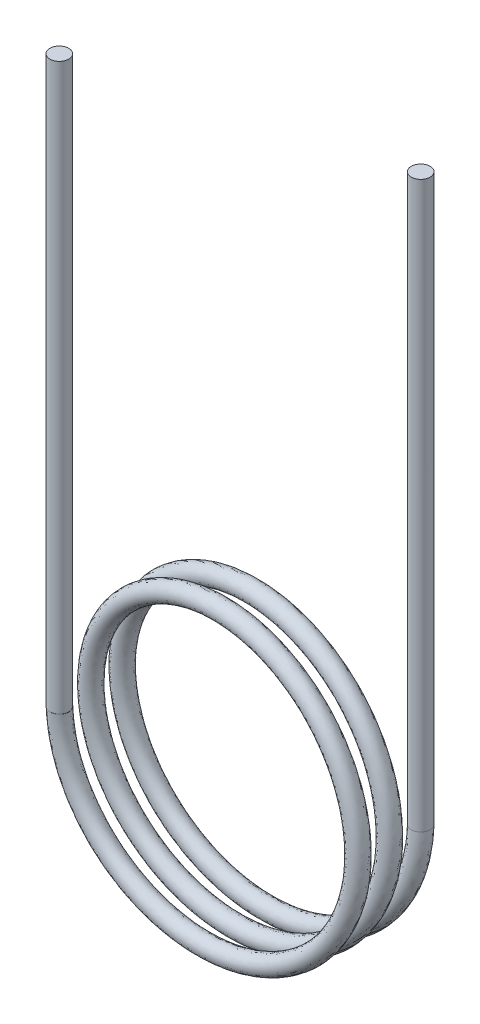
ISO-10303-21;
HEADER;
FILE_DESCRIPTION(('STEP AP214'),'2;1');
FILE_NAME('part.step','',(''),(''),'','','');
FILE_SCHEMA(('AUTOMOTIVE_DESIGN { 1 0 10303 214 1 1 1 1 }'));
ENDSEC;
DATA;
#1=APPLICATION_CONTEXT('core data for automotive mechanical design processes');
#2=APPLICATION_PROTOCOL_DEFINITION('international standard','automotive_design',2000,#1);
#3=PRODUCT_CONTEXT('',#1,'mechanical');
#4=PRODUCT('Part','Part','',(#3));
#5=PRODUCT_RELATED_PRODUCT_CATEGORY('part','',(#4));
#6=PRODUCT_DEFINITION_FORMATION('','',#4);
#7=PRODUCT_DEFINITION_CONTEXT('part definition',#1,'design');
#8=PRODUCT_DEFINITION('design','',#6,#7);
#9=PRODUCT_DEFINITION_SHAPE('','',#8);
#10=(LENGTH_UNIT() NAMED_UNIT(*) SI_UNIT(.MILLI.,.METRE.));
#11=(NAMED_UNIT(*) PLANE_ANGLE_UNIT() SI_UNIT($,.RADIAN.));
#12=(NAMED_UNIT(*) SI_UNIT($,.STERADIAN.) SOLID_ANGLE_UNIT());
#13=UNCERTAINTY_MEASURE_WITH_UNIT(LENGTH_MEASURE(1.E-05),#10,'distance_accuracy_value','');
#14=(GEOMETRIC_REPRESENTATION_CONTEXT(3) GLOBAL_UNCERTAINTY_ASSIGNED_CONTEXT((#13)) GLOBAL_UNIT_ASSIGNED_CONTEXT((#10,
#11,#12)) REPRESENTATION_CONTEXT('',''));
#15=CARTESIAN_POINT('',(0.,0.,0.));
#16=DIRECTION('',(0.,0.,1.));
#17=DIRECTION('',(1.,0.,0.));
#18=AXIS2_PLACEMENT_3D('',#15,#16,#17);
#19=CARTESIAN_POINT('',(-22.5,0.,11.));
#20=DIRECTION('',(0.,1.,0.));
#21=DIRECTION('',(-1.,0.,0.));
#22=AXIS2_PLACEMENT_3D('',#19,#20,#21);
#23=PLANE('',#22);
#24=CARTESIAN_POINT('',(-22.5,0.,12.5));
#25=DIRECTION('',(0.,1.,0.));
#26=DIRECTION('',(-1.,0.,0.));
#27=AXIS2_PLACEMENT_3D('',#24,#25,#26);
#28=CIRCLE('',#27,1.5);
#29=CARTESIAN_POINT('',(-22.5185919168882,0.,13.9998847757833));
#30=VERTEX_POINT('',#29);
#31=CARTESIAN_POINT('',(-22.5185919168882,0.,11.0001152242167));
#32=VERTEX_POINT('',#31);
#33=EDGE_CURVE('E11',#30,#32,#28,.T.);
#34=ORIENTED_EDGE('',*,*,#33,.T.);
#35=CARTESIAN_POINT('',(-22.5371838337765,0.,12.5));
#36=DIRECTION('',(0.,1.,0.));
#37=DIRECTION('',(-1.,0.,0.));
#38=AXIS2_PLACEMENT_3D('',#35,#36,#37);
#39=CIRCLE('',#38,1.5);
#40=EDGE_CURVE('E50',#30,#32,#39,.T.);
#41=ORIENTED_EDGE('',*,*,#40,.F.);
#42=EDGE_LOOP('',(#34,#41));
#43=FACE_BOUND('',#42,.T.);
#44=ADVANCED_FACE('F31',(#43),#23,.T.);
#45=CARTESIAN_POINT('',(22.5,0.,1.5));
#46=CARTESIAN_POINT('',(22.5,-6.02885682970026,1.70833333333333));
#47=CARTESIAN_POINT('',(19.4855715851499,-11.25,1.91666666666667));
#48=CARTESIAN_POINT('',(16.4711431702997,-16.4711431702997,2.125));
#49=CARTESIAN_POINT('',(11.25,-19.4855715851499,2.33333333333333));
#50=CARTESIAN_POINT('',(6.02885682970027,-22.5,2.54166666666667));
#51=CARTESIAN_POINT('',(0.,-22.5,2.75));
#52=CARTESIAN_POINT('',(-6.02885682970026,-22.5,2.95833333333333));
#53=CARTESIAN_POINT('',(-11.25,-19.4855715851499,3.16666666666667));
#54=CARTESIAN_POINT('',(-16.4711431702997,-16.4711431702997,3.375));
#55=CARTESIAN_POINT('',(-19.4855715851499,-11.25,3.58333333333333));
#56=CARTESIAN_POINT('',(-22.5,-6.02885682970027,3.79166666666667));
#57=CARTESIAN_POINT('',(-22.5,0.,4.));
#58=CARTESIAN_POINT('',(-22.5,6.02885682970025,4.20833333333333));
#59=CARTESIAN_POINT('',(-19.4855715851499,11.25,4.41666666666667));
#60=CARTESIAN_POINT('',(-16.4711431702997,16.4711431702997,4.625));
#61=CARTESIAN_POINT('',(-11.25,19.4855715851499,4.83333333333333));
#62=CARTESIAN_POINT('',(-6.02885682970028,22.5,5.04166666666667));
#63=CARTESIAN_POINT('',(0.,22.5,5.25));
#64=CARTESIAN_POINT('',(6.02885682970025,22.5,5.45833333333333));
#65=CARTESIAN_POINT('',(11.25,19.4855715851499,5.66666666666667));
#66=CARTESIAN_POINT('',(16.4711431702997,16.4711431702997,5.875));
#67=CARTESIAN_POINT('',(19.4855715851499,11.25,6.08333333333333));
#68=CARTESIAN_POINT('',(22.5,6.02885682970028,6.29166666666667));
#69=CARTESIAN_POINT('',(22.5,0.,6.5));
#70=CARTESIAN_POINT('',(22.5,-6.02885682970026,6.70833333333333));
#71=CARTESIAN_POINT('',(19.4855715851499,-11.25,6.91666666666667));
#72=CARTESIAN_POINT('',(16.4711431702997,-16.4711431702997,7.125));
#73=CARTESIAN_POINT('',(11.25,-19.4855715851499,7.33333333333333));
#74=CARTESIAN_POINT('',(6.02885682970027,-22.5,7.54166666666667));
#75=CARTESIAN_POINT('',(0.,-22.5,7.75));
#76=CARTESIAN_POINT('',(-6.02885682970026,-22.5,7.95833333333333));
#77=CARTESIAN_POINT('',(-11.25,-19.4855715851499,8.16666666666667));
#78=CARTESIAN_POINT('',(-16.4711431702997,-16.4711431702997,8.375));
#79=CARTESIAN_POINT('',(-19.4855715851499,-11.25,8.58333333333334));
#80=CARTESIAN_POINT('',(-22.5,-6.02885682970027,8.79166666666667));
#81=CARTESIAN_POINT('',(-22.5,0.,9.));
#82=CARTESIAN_POINT('',(-22.5,6.02885682970025,9.20833333333333));
#83=CARTESIAN_POINT('',(-19.4855715851499,11.25,9.41666666666667));
#84=CARTESIAN_POINT('',(-16.4711431702997,16.4711431702997,9.625));
#85=CARTESIAN_POINT('',(-11.25,19.4855715851499,9.83333333333333));
#86=CARTESIAN_POINT('',(-6.02885682970028,22.5,10.0416666666667));
#87=CARTESIAN_POINT('',(0.,22.5,10.25));
#88=CARTESIAN_POINT('',(6.02885682970025,22.5,10.4583333333333));
#89=CARTESIAN_POINT('',(11.25,19.4855715851499,10.6666666666667));
#90=CARTESIAN_POINT('',(16.4711431702997,16.4711431702997,10.875));
#91=CARTESIAN_POINT('',(19.4855715851499,11.25,11.0833333333333));
#92=CARTESIAN_POINT('',(22.5,6.02885682970028,11.2916666666667));
#93=CARTESIAN_POINT('',(22.5,0.,11.5));
#94=CARTESIAN_POINT('',(22.5,-6.02885682970026,11.7083333333333));
#95=CARTESIAN_POINT('',(19.4855715851499,-11.25,11.9166666666667));
#96=CARTESIAN_POINT('',(16.4711431702997,-16.4711431702997,12.125));
#97=CARTESIAN_POINT('',(11.25,-19.4855715851499,12.3333333333333));
#98=CARTESIAN_POINT('',(6.02885682970027,-22.5,12.5416666666667));
#99=CARTESIAN_POINT('',(0.,-22.5,12.75));
#100=CARTESIAN_POINT('',(-6.02885682970026,-22.5,12.9583333333333));
#101=CARTESIAN_POINT('',(-11.25,-19.4855715851499,13.1666666666667));
#102=CARTESIAN_POINT('',(-16.4711431702997,-16.4711431702997,13.375));
#103=CARTESIAN_POINT('',(-19.4855715851499,-11.25,13.5833333333333));
#104=CARTESIAN_POINT('',(-22.5,-6.02885682970027,13.7916666666667));
#105=CARTESIAN_POINT('',(-22.5,0.,14.));
#106=CARTESIAN_POINT('',(25.5,0.,1.5));
#107=CARTESIAN_POINT('',(25.5,-6.83270440699363,1.70833333333333));
#108=CARTESIAN_POINT('',(22.0836477965032,-12.75,1.91666666666667));
#109=CARTESIAN_POINT('',(18.6672955930064,-18.6672955930064,2.125));
#110=CARTESIAN_POINT('',(12.75,-22.0836477965032,2.33333333333333));
#111=CARTESIAN_POINT('',(6.83270440699364,-25.5,2.54166666666667));
#112=CARTESIAN_POINT('',(0.,-25.5,2.75));
#113=CARTESIAN_POINT('',(-6.83270440699363,-25.5,2.95833333333333));
#114=CARTESIAN_POINT('',(-12.75,-22.0836477965032,3.16666666666667));
#115=CARTESIAN_POINT('',(-18.6672955930064,-18.6672955930064,3.375));
#116=CARTESIAN_POINT('',(-22.0836477965032,-12.75,3.58333333333333));
#117=CARTESIAN_POINT('',(-25.5,-6.83270440699364,3.79166666666667));
#118=CARTESIAN_POINT('',(-25.5,0.,4.));
#119=CARTESIAN_POINT('',(-25.5,6.83270440699362,4.20833333333333));
#120=CARTESIAN_POINT('',(-22.0836477965032,12.75,4.41666666666667));
#121=CARTESIAN_POINT('',(-18.6672955930064,18.6672955930064,4.625));
#122=CARTESIAN_POINT('',(-12.75,22.0836477965032,4.83333333333333));
#123=CARTESIAN_POINT('',(-6.83270440699365,25.5,5.04166666666667));
#124=CARTESIAN_POINT('',(0.,25.5,5.25));
#125=CARTESIAN_POINT('',(6.83270440699362,25.5,5.45833333333333));
#126=CARTESIAN_POINT('',(12.75,22.0836477965032,5.66666666666667));
#127=CARTESIAN_POINT('',(18.6672955930064,18.6672955930064,5.875));
#128=CARTESIAN_POINT('',(22.0836477965032,12.75,6.08333333333333));
#129=CARTESIAN_POINT('',(25.5,6.83270440699365,6.29166666666667));
#130=CARTESIAN_POINT('',(25.5,0.,6.5));
#131=CARTESIAN_POINT('',(25.5,-6.83270440699363,6.70833333333333));
#132=CARTESIAN_POINT('',(22.0836477965032,-12.75,6.91666666666667));
#133=CARTESIAN_POINT('',(18.6672955930064,-18.6672955930064,7.125));
#134=CARTESIAN_POINT('',(12.75,-22.0836477965032,7.33333333333333));
#135=CARTESIAN_POINT('',(6.83270440699364,-25.5,7.54166666666667));
#136=CARTESIAN_POINT('',(0.,-25.5,7.75));
#137=CARTESIAN_POINT('',(-6.83270440699363,-25.5,7.95833333333334));
#138=CARTESIAN_POINT('',(-12.75,-22.0836477965032,8.16666666666667));
#139=CARTESIAN_POINT('',(-18.6672955930064,-18.6672955930064,8.375));
#140=CARTESIAN_POINT('',(-22.0836477965032,-12.75,8.58333333333334));
#141=CARTESIAN_POINT('',(-25.5,-6.83270440699364,8.79166666666667));
#142=CARTESIAN_POINT('',(-25.5,0.,9.));
#143=CARTESIAN_POINT('',(-25.5,6.83270440699362,9.20833333333333));
#144=CARTESIAN_POINT('',(-22.0836477965032,12.75,9.41666666666667));
#145=CARTESIAN_POINT('',(-18.6672955930064,18.6672955930064,9.625));
#146=CARTESIAN_POINT('',(-12.75,22.0836477965032,9.83333333333333));
#147=CARTESIAN_POINT('',(-6.83270440699365,25.5,10.0416666666667));
#148=CARTESIAN_POINT('',(0.,25.5,10.25));
#149=CARTESIAN_POINT('',(6.83270440699362,25.5,10.4583333333333));
#150=CARTESIAN_POINT('',(12.75,22.0836477965032,10.6666666666667));
#151=CARTESIAN_POINT('',(18.6672955930064,18.6672955930064,10.875));
#152=CARTESIAN_POINT('',(22.0836477965032,12.75,11.0833333333333));
#153=CARTESIAN_POINT('',(25.5,6.83270440699365,11.2916666666667));
#154=CARTESIAN_POINT('',(25.5,0.,11.5));
#155=CARTESIAN_POINT('',(25.5,-6.83270440699363,11.7083333333333));
#156=CARTESIAN_POINT('',(22.0836477965032,-12.75,11.9166666666667));
#157=CARTESIAN_POINT('',(18.6672955930064,-18.6672955930064,12.125));
#158=CARTESIAN_POINT('',(12.75,-22.0836477965032,12.3333333333333));
#159=CARTESIAN_POINT('',(6.83270440699364,-25.5,12.5416666666667));
#160=CARTESIAN_POINT('',(0.,-25.5,12.75));
#161=CARTESIAN_POINT('',(-6.83270440699363,-25.5,12.9583333333333));
#162=CARTESIAN_POINT('',(-12.75,-22.0836477965032,13.1666666666667));
#163=CARTESIAN_POINT('',(-18.6672955930064,-18.6672955930064,13.375));
#164=CARTESIAN_POINT('',(-22.0836477965032,-12.75,13.5833333333333));
#165=CARTESIAN_POINT('',(-25.5,-6.83270440699364,13.7916666666667));
#166=CARTESIAN_POINT('',(-25.5,0.,14.));
#167=CARTESIAN_POINT('',(25.5,0.,-1.5));
#168=CARTESIAN_POINT('',(25.5,-6.83270440699363,-1.29166666666667));
#169=CARTESIAN_POINT('',(22.0836477965032,-12.75,-1.08333333333333));
#170=CARTESIAN_POINT('',(18.6672955930064,-18.6672955930064,-0.875));
#171=CARTESIAN_POINT('',(12.75,-22.0836477965032,-0.666666666666667));
#172=CARTESIAN_POINT('',(6.83270440699364,-25.5,-0.458333333333333));
#173=CARTESIAN_POINT('',(0.,-25.5,-0.25));
#174=CARTESIAN_POINT('',(-6.83270440699363,-25.5,-0.0416666666666666));
#175=CARTESIAN_POINT('',(-12.75,-22.0836477965032,0.166666666666667));
#176=CARTESIAN_POINT('',(-18.6672955930064,-18.6672955930064,0.375));
#177=CARTESIAN_POINT('',(-22.0836477965032,-12.75,0.583333333333333));
#178=CARTESIAN_POINT('',(-25.5,-6.83270440699364,0.791666666666667));
#179=CARTESIAN_POINT('',(-25.5,0.,1.));
#180=CARTESIAN_POINT('',(-25.5,6.83270440699362,1.20833333333333));
#181=CARTESIAN_POINT('',(-22.0836477965032,12.75,1.41666666666667));
#182=CARTESIAN_POINT('',(-18.6672955930064,18.6672955930064,1.625));
#183=CARTESIAN_POINT('',(-12.75,22.0836477965032,1.83333333333333));
#184=CARTESIAN_POINT('',(-6.83270440699365,25.5,2.04166666666667));
#185=CARTESIAN_POINT('',(0.,25.5,2.25));
#186=CARTESIAN_POINT('',(6.83270440699362,25.5,2.45833333333333));
#187=CARTESIAN_POINT('',(12.75,22.0836477965032,2.66666666666667));
#188=CARTESIAN_POINT('',(18.6672955930064,18.6672955930064,2.875));
#189=CARTESIAN_POINT('',(22.0836477965032,12.75,3.08333333333333));
#190=CARTESIAN_POINT('',(25.5,6.83270440699365,3.29166666666667));
#191=CARTESIAN_POINT('',(25.5,0.,3.5));
#192=CARTESIAN_POINT('',(25.5,-6.83270440699363,3.70833333333333));
#193=CARTESIAN_POINT('',(22.0836477965032,-12.75,3.91666666666667));
#194=CARTESIAN_POINT('',(18.6672955930064,-18.6672955930064,4.125));
#195=CARTESIAN_POINT('',(12.75,-22.0836477965032,4.33333333333333));
#196=CARTESIAN_POINT('',(6.83270440699364,-25.5,4.54166666666667));
#197=CARTESIAN_POINT('',(0.,-25.5,4.75));
#198=CARTESIAN_POINT('',(-6.83270440699363,-25.5,4.95833333333333));
#199=CARTESIAN_POINT('',(-12.75,-22.0836477965032,5.16666666666667));
#200=CARTESIAN_POINT('',(-18.6672955930064,-18.6672955930064,5.375));
#201=CARTESIAN_POINT('',(-22.0836477965032,-12.75,5.58333333333333));
#202=CARTESIAN_POINT('',(-25.5,-6.83270440699364,5.79166666666667));
#203=CARTESIAN_POINT('',(-25.5,0.,6.));
#204=CARTESIAN_POINT('',(-25.5,6.83270440699362,6.20833333333333));
#205=CARTESIAN_POINT('',(-22.0836477965032,12.75,6.41666666666667));
#206=CARTESIAN_POINT('',(-18.6672955930064,18.6672955930064,6.625));
#207=CARTESIAN_POINT('',(-12.75,22.0836477965032,6.83333333333333));
#208=CARTESIAN_POINT('',(-6.83270440699365,25.5,7.04166666666667));
#209=CARTESIAN_POINT('',(0.,25.5,7.25));
#210=CARTESIAN_POINT('',(6.83270440699362,25.5,7.45833333333333));
#211=CARTESIAN_POINT('',(12.75,22.0836477965032,7.66666666666667));
#212=CARTESIAN_POINT('',(18.6672955930064,18.6672955930064,7.875));
#213=CARTESIAN_POINT('',(22.0836477965032,12.75,8.08333333333333));
#214=CARTESIAN_POINT('',(25.5,6.83270440699365,8.29166666666667));
#215=CARTESIAN_POINT('',(25.5,0.,8.5));
#216=CARTESIAN_POINT('',(25.5,-6.83270440699363,8.70833333333333));
#217=CARTESIAN_POINT('',(22.0836477965032,-12.75,8.91666666666667));
#218=CARTESIAN_POINT('',(18.6672955930064,-18.6672955930064,9.125));
#219=CARTESIAN_POINT('',(12.75,-22.0836477965032,9.33333333333333));
#220=CARTESIAN_POINT('',(6.83270440699364,-25.5,9.54166666666667));
#221=CARTESIAN_POINT('',(0.,-25.5,9.75));
#222=CARTESIAN_POINT('',(-6.83270440699363,-25.5,9.95833333333333));
#223=CARTESIAN_POINT('',(-12.75,-22.0836477965032,10.1666666666667));
#224=CARTESIAN_POINT('',(-18.6672955930064,-18.6672955930064,10.375));
#225=CARTESIAN_POINT('',(-22.0836477965032,-12.75,10.5833333333333));
#226=CARTESIAN_POINT('',(-25.5,-6.83270440699364,10.7916666666667));
#227=CARTESIAN_POINT('',(-25.5,0.,11.));
#228=CARTESIAN_POINT('',(22.5,0.,-1.5));
#229=CARTESIAN_POINT('',(22.5,-6.02885682970026,-1.29166666666667));
#230=CARTESIAN_POINT('',(19.4855715851499,-11.25,-1.08333333333333));
#231=CARTESIAN_POINT('',(16.4711431702997,-16.4711431702997,-0.875000000000001));
#232=CARTESIAN_POINT('',(11.25,-19.4855715851499,-0.666666666666667));
#233=CARTESIAN_POINT('',(6.02885682970027,-22.5,-0.458333333333334));
#234=CARTESIAN_POINT('',(0.,-22.5,-0.250000000000001));
#235=CARTESIAN_POINT('',(-6.02885682970026,-22.5,-0.0416666666666673));
#236=CARTESIAN_POINT('',(-11.25,-19.4855715851499,0.166666666666666));
#237=CARTESIAN_POINT('',(-16.4711431702997,-16.4711431702997,0.374999999999999));
#238=CARTESIAN_POINT('',(-19.4855715851499,-11.25,0.583333333333333));
#239=CARTESIAN_POINT('',(-22.5,-6.02885682970027,0.791666666666666));
#240=CARTESIAN_POINT('',(-22.5,0.,0.999999999999999));
#241=CARTESIAN_POINT('',(-22.5,6.02885682970025,1.20833333333333));
#242=CARTESIAN_POINT('',(-19.4855715851499,11.25,1.41666666666667));
#243=CARTESIAN_POINT('',(-16.4711431702997,16.4711431702997,1.625));
#244=CARTESIAN_POINT('',(-11.25,19.4855715851499,1.83333333333333));
#245=CARTESIAN_POINT('',(-6.02885682970028,22.5,2.04166666666667));
#246=CARTESIAN_POINT('',(0.,22.5,2.25));
#247=CARTESIAN_POINT('',(6.02885682970025,22.5,2.45833333333333));
#248=CARTESIAN_POINT('',(11.25,19.4855715851499,2.66666666666667));
#249=CARTESIAN_POINT('',(16.4711431702997,16.4711431702997,2.875));
#250=CARTESIAN_POINT('',(19.4855715851499,11.25,3.08333333333333));
#251=CARTESIAN_POINT('',(22.5,6.02885682970028,3.29166666666667));
#252=CARTESIAN_POINT('',(22.5,0.,3.5));
#253=CARTESIAN_POINT('',(22.5,-6.02885682970026,3.70833333333333));
#254=CARTESIAN_POINT('',(19.4855715851499,-11.25,3.91666666666667));
#255=CARTESIAN_POINT('',(16.4711431702997,-16.4711431702997,4.125));
#256=CARTESIAN_POINT('',(11.25,-19.4855715851499,4.33333333333333));
#257=CARTESIAN_POINT('',(6.02885682970027,-22.5,4.54166666666667));
#258=CARTESIAN_POINT('',(0.,-22.5,4.75));
#259=CARTESIAN_POINT('',(-6.02885682970026,-22.5,4.95833333333333));
#260=CARTESIAN_POINT('',(-11.25,-19.4855715851499,5.16666666666667));
#261=CARTESIAN_POINT('',(-16.4711431702997,-16.4711431702997,5.375));
#262=CARTESIAN_POINT('',(-19.4855715851499,-11.25,5.58333333333333));
#263=CARTESIAN_POINT('',(-22.5,-6.02885682970027,5.79166666666667));
#264=CARTESIAN_POINT('',(-22.5,0.,6.));
#265=CARTESIAN_POINT('',(-22.5,6.02885682970025,6.20833333333333));
#266=CARTESIAN_POINT('',(-19.4855715851499,11.25,6.41666666666667));
#267=CARTESIAN_POINT('',(-16.4711431702997,16.4711431702997,6.625));
#268=CARTESIAN_POINT('',(-11.25,19.4855715851499,6.83333333333333));
#269=CARTESIAN_POINT('',(-6.02885682970028,22.5,7.04166666666667));
#270=CARTESIAN_POINT('',(0.,22.5,7.25));
#271=CARTESIAN_POINT('',(6.02885682970025,22.5,7.45833333333333));
#272=CARTESIAN_POINT('',(11.25,19.4855715851499,7.66666666666667));
#273=CARTESIAN_POINT('',(16.4711431702997,16.4711431702997,7.875));
#274=CARTESIAN_POINT('',(19.4855715851499,11.25,8.08333333333333));
#275=CARTESIAN_POINT('',(22.5,6.02885682970028,8.29166666666667));
#276=CARTESIAN_POINT('',(22.5,0.,8.5));
#277=CARTESIAN_POINT('',(22.5,-6.02885682970026,8.70833333333333));
#278=CARTESIAN_POINT('',(19.4855715851499,-11.25,8.91666666666667));
#279=CARTESIAN_POINT('',(16.4711431702997,-16.4711431702997,9.125));
#280=CARTESIAN_POINT('',(11.25,-19.4855715851499,9.33333333333333));
#281=CARTESIAN_POINT('',(6.02885682970027,-22.5,9.54166666666667));
#282=CARTESIAN_POINT('',(0.,-22.5,9.75));
#283=CARTESIAN_POINT('',(-6.02885682970026,-22.5,9.95833333333333));
#284=CARTESIAN_POINT('',(-11.25,-19.4855715851499,10.1666666666667));
#285=CARTESIAN_POINT('',(-16.4711431702997,-16.4711431702997,10.375));
#286=CARTESIAN_POINT('',(-19.4855715851499,-11.25,10.5833333333333));
#287=CARTESIAN_POINT('',(-22.5,-6.02885682970027,10.7916666666667));
#288=CARTESIAN_POINT('',(-22.5,0.,11.));
#289=CARTESIAN_POINT('',(19.5,0.,-1.5));
#290=CARTESIAN_POINT('',(19.5,-5.22500925240689,-1.29166666666667));
#291=CARTESIAN_POINT('',(16.8874953737966,-9.75,-1.08333333333333));
#292=CARTESIAN_POINT('',(14.2749907475931,-14.2749907475931,-0.875000000000001));
#293=CARTESIAN_POINT('',(9.75,-16.8874953737966,-0.666666666666668));
#294=CARTESIAN_POINT('',(5.2250092524069,-19.5,-0.458333333333335));
#295=CARTESIAN_POINT('',(0.,-19.5,-0.250000000000001));
#296=CARTESIAN_POINT('',(-5.22500925240689,-19.5,-0.0416666666666677));
#297=CARTESIAN_POINT('',(-9.75,-16.8874953737966,0.166666666666666));
#298=CARTESIAN_POINT('',(-14.2749907475931,-14.2749907475931,0.374999999999999));
#299=CARTESIAN_POINT('',(-16.8874953737966,-9.75000000000001,0.583333333333332));
#300=CARTESIAN_POINT('',(-19.5,-5.2250092524069,0.791666666666666));
#301=CARTESIAN_POINT('',(-19.5,0.,0.999999999999999));
#302=CARTESIAN_POINT('',(-19.5,5.22500925240688,1.20833333333333));
#303=CARTESIAN_POINT('',(-16.8874953737966,9.74999999999999,1.41666666666667));
#304=CARTESIAN_POINT('',(-14.2749907475931,14.2749907475931,1.625));
#305=CARTESIAN_POINT('',(-9.75000000000001,16.8874953737965,1.83333333333333));
#306=CARTESIAN_POINT('',(-5.22500925240691,19.5,2.04166666666667));
#307=CARTESIAN_POINT('',(0.,19.5,2.25));
#308=CARTESIAN_POINT('',(5.22500925240688,19.5,2.45833333333333));
#309=CARTESIAN_POINT('',(9.74999999999999,16.8874953737966,2.66666666666667));
#310=CARTESIAN_POINT('',(14.2749907475931,14.2749907475931,2.875));
#311=CARTESIAN_POINT('',(16.8874953737965,9.75000000000001,3.08333333333333));
#312=CARTESIAN_POINT('',(19.5,5.22500925240691,3.29166666666667));
#313=CARTESIAN_POINT('',(19.5,0.,3.5));
#314=CARTESIAN_POINT('',(19.5,-5.22500925240689,3.70833333333333));
#315=CARTESIAN_POINT('',(16.8874953737966,-9.75,3.91666666666667));
#316=CARTESIAN_POINT('',(14.2749907475931,-14.2749907475931,4.125));
#317=CARTESIAN_POINT('',(9.75,-16.8874953737966,4.33333333333333));
#318=CARTESIAN_POINT('',(5.2250092524069,-19.5,4.54166666666667));
#319=CARTESIAN_POINT('',(0.,-19.5,4.75));
#320=CARTESIAN_POINT('',(-5.22500925240689,-19.5,4.95833333333333));
#321=CARTESIAN_POINT('',(-9.75,-16.8874953737966,5.16666666666667));
#322=CARTESIAN_POINT('',(-14.2749907475931,-14.2749907475931,5.375));
#323=CARTESIAN_POINT('',(-16.8874953737966,-9.75000000000001,5.58333333333333));
#324=CARTESIAN_POINT('',(-19.5,-5.2250092524069,5.79166666666667));
#325=CARTESIAN_POINT('',(-19.5,0.,6.));
#326=CARTESIAN_POINT('',(-19.5,5.22500925240688,6.20833333333333));
#327=CARTESIAN_POINT('',(-16.8874953737966,9.74999999999999,6.41666666666667));
#328=CARTESIAN_POINT('',(-14.2749907475931,14.2749907475931,6.625));
#329=CARTESIAN_POINT('',(-9.75000000000001,16.8874953737965,6.83333333333333));
#330=CARTESIAN_POINT('',(-5.22500925240691,19.5,7.04166666666667));
#331=CARTESIAN_POINT('',(0.,19.5,7.25));
#332=CARTESIAN_POINT('',(5.22500925240688,19.5,7.45833333333333));
#333=CARTESIAN_POINT('',(9.74999999999999,16.8874953737966,7.66666666666667));
#334=CARTESIAN_POINT('',(14.2749907475931,14.2749907475931,7.875));
#335=CARTESIAN_POINT('',(16.8874953737965,9.75000000000001,8.08333333333333));
#336=CARTESIAN_POINT('',(19.5,5.22500925240691,8.29166666666667));
#337=CARTESIAN_POINT('',(19.5,0.,8.5));
#338=CARTESIAN_POINT('',(19.5,-5.22500925240689,8.70833333333333));
#339=CARTESIAN_POINT('',(16.8874953737966,-9.75,8.91666666666667));
#340=CARTESIAN_POINT('',(14.2749907475931,-14.2749907475931,9.125));
#341=CARTESIAN_POINT('',(9.75,-16.8874953737966,9.33333333333333));
#342=CARTESIAN_POINT('',(5.2250092524069,-19.5,9.54166666666667));
#343=CARTESIAN_POINT('',(0.,-19.5,9.75));
#344=CARTESIAN_POINT('',(-5.22500925240689,-19.5,9.95833333333333));
#345=CARTESIAN_POINT('',(-9.75,-16.8874953737966,10.1666666666667));
#346=CARTESIAN_POINT('',(-14.2749907475931,-14.2749907475931,10.375));
#347=CARTESIAN_POINT('',(-16.8874953737966,-9.75000000000001,10.5833333333333));
#348=CARTESIAN_POINT('',(-19.5,-5.2250092524069,10.7916666666667));
#349=CARTESIAN_POINT('',(-19.5,0.,11.));
#350=CARTESIAN_POINT('',(19.5,0.,1.5));
#351=CARTESIAN_POINT('',(19.5,-5.22500925240689,1.70833333333333));
#352=CARTESIAN_POINT('',(16.8874953737966,-9.75,1.91666666666667));
#353=CARTESIAN_POINT('',(14.2749907475931,-14.2749907475931,2.125));
#354=CARTESIAN_POINT('',(9.75,-16.8874953737966,2.33333333333333));
#355=CARTESIAN_POINT('',(5.2250092524069,-19.5,2.54166666666667));
#356=CARTESIAN_POINT('',(0.,-19.5,2.75));
#357=CARTESIAN_POINT('',(-5.22500925240689,-19.5,2.95833333333333));
#358=CARTESIAN_POINT('',(-9.75,-16.8874953737966,3.16666666666667));
#359=CARTESIAN_POINT('',(-14.2749907475931,-14.2749907475931,3.375));
#360=CARTESIAN_POINT('',(-16.8874953737966,-9.75000000000001,3.58333333333333));
#361=CARTESIAN_POINT('',(-19.5,-5.2250092524069,3.79166666666667));
#362=CARTESIAN_POINT('',(-19.5,0.,4.));
#363=CARTESIAN_POINT('',(-19.5,5.22500925240688,4.20833333333333));
#364=CARTESIAN_POINT('',(-16.8874953737966,9.74999999999999,4.41666666666667));
#365=CARTESIAN_POINT('',(-14.2749907475931,14.2749907475931,4.625));
#366=CARTESIAN_POINT('',(-9.75000000000001,16.8874953737965,4.83333333333333));
#367=CARTESIAN_POINT('',(-5.22500925240691,19.5,5.04166666666667));
#368=CARTESIAN_POINT('',(0.,19.5,5.25));
#369=CARTESIAN_POINT('',(5.22500925240688,19.5,5.45833333333333));
#370=CARTESIAN_POINT('',(9.74999999999999,16.8874953737966,5.66666666666667));
#371=CARTESIAN_POINT('',(14.2749907475931,14.2749907475931,5.875));
#372=CARTESIAN_POINT('',(16.8874953737965,9.75000000000001,6.08333333333333));
#373=CARTESIAN_POINT('',(19.5,5.22500925240691,6.29166666666667));
#374=CARTESIAN_POINT('',(19.5,0.,6.5));
#375=CARTESIAN_POINT('',(19.5,-5.22500925240689,6.70833333333333));
#376=CARTESIAN_POINT('',(16.8874953737966,-9.75,6.91666666666667));
#377=CARTESIAN_POINT('',(14.2749907475931,-14.2749907475931,7.125));
#378=CARTESIAN_POINT('',(9.75,-16.8874953737966,7.33333333333333));
#379=CARTESIAN_POINT('',(5.2250092524069,-19.5,7.54166666666667));
#380=CARTESIAN_POINT('',(0.,-19.5,7.75));
#381=CARTESIAN_POINT('',(-5.22500925240689,-19.5,7.95833333333334));
#382=CARTESIAN_POINT('',(-9.75,-16.8874953737966,8.16666666666667));
#383=CARTESIAN_POINT('',(-14.2749907475931,-14.2749907475931,8.375));
#384=CARTESIAN_POINT('',(-16.8874953737966,-9.75000000000001,8.58333333333334));
#385=CARTESIAN_POINT('',(-19.5,-5.2250092524069,8.79166666666667));
#386=CARTESIAN_POINT('',(-19.5,0.,9.));
#387=CARTESIAN_POINT('',(-19.5,5.22500925240688,9.20833333333333));
#388=CARTESIAN_POINT('',(-16.8874953737966,9.74999999999999,9.41666666666667));
#389=CARTESIAN_POINT('',(-14.2749907475931,14.2749907475931,9.625));
#390=CARTESIAN_POINT('',(-9.75000000000001,16.8874953737965,9.83333333333333));
#391=CARTESIAN_POINT('',(-5.22500925240691,19.5,10.0416666666667));
#392=CARTESIAN_POINT('',(0.,19.5,10.25));
#393=CARTESIAN_POINT('',(5.22500925240688,19.5,10.4583333333333));
#394=CARTESIAN_POINT('',(9.74999999999999,16.8874953737966,10.6666666666667));
#395=CARTESIAN_POINT('',(14.2749907475931,14.2749907475931,10.875));
#396=CARTESIAN_POINT('',(16.8874953737965,9.75000000000001,11.0833333333333));
#397=CARTESIAN_POINT('',(19.5,5.22500925240691,11.2916666666667));
#398=CARTESIAN_POINT('',(19.5,0.,11.5));
#399=CARTESIAN_POINT('',(19.5,-5.22500925240689,11.7083333333333));
#400=CARTESIAN_POINT('',(16.8874953737966,-9.75,11.9166666666667));
#401=CARTESIAN_POINT('',(14.2749907475931,-14.2749907475931,12.125));
#402=CARTESIAN_POINT('',(9.75,-16.8874953737966,12.3333333333333));
#403=CARTESIAN_POINT('',(5.2250092524069,-19.5,12.5416666666667));
#404=CARTESIAN_POINT('',(0.,-19.5,12.75));
#405=CARTESIAN_POINT('',(-5.22500925240689,-19.5,12.9583333333333));
#406=CARTESIAN_POINT('',(-9.75,-16.8874953737966,13.1666666666667));
#407=CARTESIAN_POINT('',(-14.2749907475931,-14.2749907475931,13.375));
#408=CARTESIAN_POINT('',(-16.8874953737966,-9.75000000000001,13.5833333333333));
#409=CARTESIAN_POINT('',(-19.5,-5.2250092524069,13.7916666666667));
#410=CARTESIAN_POINT('',(-19.5,0.,14.));
#411=CARTESIAN_POINT('',(22.5,0.,1.5));
#412=CARTESIAN_POINT('',(22.5,-6.02885682970026,1.70833333333333));
#413=CARTESIAN_POINT('',(19.4855715851499,-11.25,1.91666666666667));
#414=CARTESIAN_POINT('',(16.4711431702997,-16.4711431702997,2.125));
#415=CARTESIAN_POINT('',(11.25,-19.4855715851499,2.33333333333333));
#416=CARTESIAN_POINT('',(6.02885682970027,-22.5,2.54166666666667));
#417=CARTESIAN_POINT('',(0.,-22.5,2.75));
#418=CARTESIAN_POINT('',(-6.02885682970026,-22.5,2.95833333333333));
#419=CARTESIAN_POINT('',(-11.25,-19.4855715851499,3.16666666666667));
#420=CARTESIAN_POINT('',(-16.4711431702997,-16.4711431702997,3.375));
#421=CARTESIAN_POINT('',(-19.4855715851499,-11.25,3.58333333333333));
#422=CARTESIAN_POINT('',(-22.5,-6.02885682970027,3.79166666666667));
#423=CARTESIAN_POINT('',(-22.5,0.,4.));
#424=CARTESIAN_POINT('',(-22.5,6.02885682970025,4.20833333333333));
#425=CARTESIAN_POINT('',(-19.4855715851499,11.25,4.41666666666667));
#426=CARTESIAN_POINT('',(-16.4711431702997,16.4711431702997,4.625));
#427=CARTESIAN_POINT('',(-11.25,19.4855715851499,4.83333333333333));
#428=CARTESIAN_POINT('',(-6.02885682970028,22.5,5.04166666666667));
#429=CARTESIAN_POINT('',(0.,22.5,5.25));
#430=CARTESIAN_POINT('',(6.02885682970025,22.5,5.45833333333333));
#431=CARTESIAN_POINT('',(11.25,19.4855715851499,5.66666666666667));
#432=CARTESIAN_POINT('',(16.4711431702997,16.4711431702997,5.875));
#433=CARTESIAN_POINT('',(19.4855715851499,11.25,6.08333333333333));
#434=CARTESIAN_POINT('',(22.5,6.02885682970028,6.29166666666667));
#435=CARTESIAN_POINT('',(22.5,0.,6.5));
#436=CARTESIAN_POINT('',(22.5,-6.02885682970026,6.70833333333333));
#437=CARTESIAN_POINT('',(19.4855715851499,-11.25,6.91666666666667));
#438=CARTESIAN_POINT('',(16.4711431702997,-16.4711431702997,7.125));
#439=CARTESIAN_POINT('',(11.25,-19.4855715851499,7.33333333333333));
#440=CARTESIAN_POINT('',(6.02885682970027,-22.5,7.54166666666667));
#441=CARTESIAN_POINT('',(0.,-22.5,7.75));
#442=CARTESIAN_POINT('',(-6.02885682970026,-22.5,7.95833333333333));
#443=CARTESIAN_POINT('',(-11.25,-19.4855715851499,8.16666666666667));
#444=CARTESIAN_POINT('',(-16.4711431702997,-16.4711431702997,8.375));
#445=CARTESIAN_POINT('',(-19.4855715851499,-11.25,8.58333333333334));
#446=CARTESIAN_POINT('',(-22.5,-6.02885682970027,8.79166666666667));
#447=CARTESIAN_POINT('',(-22.5,0.,9.));
#448=CARTESIAN_POINT('',(-22.5,6.02885682970025,9.20833333333333));
#449=CARTESIAN_POINT('',(-19.4855715851499,11.25,9.41666666666667));
#450=CARTESIAN_POINT('',(-16.4711431702997,16.4711431702997,9.625));
#451=CARTESIAN_POINT('',(-11.25,19.4855715851499,9.83333333333333));
#452=CARTESIAN_POINT('',(-6.02885682970028,22.5,10.0416666666667));
#453=CARTESIAN_POINT('',(0.,22.5,10.25));
#454=CARTESIAN_POINT('',(6.02885682970025,22.5,10.4583333333333));
#455=CARTESIAN_POINT('',(11.25,19.4855715851499,10.6666666666667));
#456=CARTESIAN_POINT('',(16.4711431702997,16.4711431702997,10.875));
#457=CARTESIAN_POINT('',(19.4855715851499,11.25,11.0833333333333));
#458=CARTESIAN_POINT('',(22.5,6.02885682970028,11.2916666666667));
#459=CARTESIAN_POINT('',(22.5,0.,11.5));
#460=CARTESIAN_POINT('',(22.5,-6.02885682970026,11.7083333333333));
#461=CARTESIAN_POINT('',(19.4855715851499,-11.25,11.9166666666667));
#462=CARTESIAN_POINT('',(16.4711431702997,-16.4711431702997,12.125));
#463=CARTESIAN_POINT('',(11.25,-19.4855715851499,12.3333333333333));
#464=CARTESIAN_POINT('',(6.02885682970027,-22.5,12.5416666666667));
#465=CARTESIAN_POINT('',(0.,-22.5,12.75));
#466=CARTESIAN_POINT('',(-6.02885682970026,-22.5,12.9583333333333));
#467=CARTESIAN_POINT('',(-11.25,-19.4855715851499,13.1666666666667));
#468=CARTESIAN_POINT('',(-16.4711431702997,-16.4711431702997,13.375));
#469=CARTESIAN_POINT('',(-19.4855715851499,-11.25,13.5833333333333));
#470=CARTESIAN_POINT('',(-22.5,-6.02885682970027,13.7916666666667));
#471=CARTESIAN_POINT('',(-22.5,0.,14.));
#472=(BOUNDED_SURFACE() B_SPLINE_SURFACE(3,2,((#45,#46,#47,#48,#49,#50,#51,#52,#53,#54,#55,#56,
#57,#58,#59,#60,#61,#62,#63,#64,#65,#66,#67,#68,#69,#70,#71,#72,#73,#74,#75,#76,#77,#78,#79,#80,
#81,#82,#83,#84,#85,#86,#87,#88,#89,#90,#91,#92,#93,#94,#95,#96,#97,#98,#99,#100,#101,#102,#103,
#104,#105),(#106,#107,#108,#109,#110,#111,#112,#113,#114,#115,#116,#117,#118,#119,#120,#121,
#122,#123,#124,#125,#126,#127,#128,#129,#130,#131,#132,#133,#134,#135,#136,#137,#138,#139,#140,
#141,#142,#143,#144,#145,#146,#147,#148,#149,#150,#151,#152,#153,#154,#155,#156,#157,#158,#159,
#160,#161,#162,#163,#164,#165,#166),(#167,#168,#169,#170,#171,#172,#173,#174,#175,#176,#177,
#178,#179,#180,#181,#182,#183,#184,#185,#186,#187,#188,#189,#190,#191,#192,#193,#194,#195,#196,
#197,#198,#199,#200,#201,#202,#203,#204,#205,#206,#207,#208,#209,#210,#211,#212,#213,#214,#215,
#216,#217,#218,#219,#220,#221,#222,#223,#224,#225,#226,#227),(#228,#229,#230,#231,#232,#233,
#234,#235,#236,#237,#238,#239,#240,#241,#242,#243,#244,#245,#246,#247,#248,#249,#250,#251,#252,
#253,#254,#255,#256,#257,#258,#259,#260,#261,#262,#263,#264,#265,#266,#267,#268,#269,#270,#271,
#272,#273,#274,#275,#276,#277,#278,#279,#280,#281,#282,#283,#284,#285,#286,#287,#288),(#289,
#290,#291,#292,#293,#294,#295,#296,#297,#298,#299,#300,#301,#302,#303,#304,#305,#306,#307,#308,
#309,#310,#311,#312,#313,#314,#315,#316,#317,#318,#319,#320,#321,#322,#323,#324,#325,#326,#327,
#328,#329,#330,#331,#332,#333,#334,#335,#336,#337,#338,#339,#340,#341,#342,#343,#344,#345,#346,
#347,#348,#349),(#350,#351,#352,#353,#354,#355,#356,#357,#358,#359,#360,#361,#362,#363,#364,
#365,#366,#367,#368,#369,#370,#371,#372,#373,#374,#375,#376,#377,#378,#379,#380,#381,#382,#383,
#384,#385,#386,#387,#388,#389,#390,#391,#392,#393,#394,#395,#396,#397,#398,#399,#400,#401,#402,
#403,#404,#405,#406,#407,#408,#409,#410),(#411,#412,#413,#414,#415,#416,#417,#418,#419,#420,
#421,#422,#423,#424,#425,#426,#427,#428,#429,#430,#431,#432,#433,#434,#435,#436,#437,#438,#439,
#440,#441,#442,#443,#444,#445,#446,#447,#448,#449,#450,#451,#452,#453,#454,#455,#456,#457,#458,
#459,#460,#461,#462,#463,#464,#465,#466,#467,#468,#469,#470,#471)),.UNSPECIFIED.,.T.,.F.,
.F.) B_SPLINE_SURFACE_WITH_KNOTS((4,3,4),(3,2,2,2,2,2,2,2,2,2,2,2,2,2,2,2,2,2,2,2,2,2,2,2,2,2,2,
2,2,2,3),(0.,0.5,1.),(0.,0.0277777777777778,0.0555555555555556,0.0833333333333333,
0.111111111111111,0.138888888888889,0.166666666666667,0.194444444444444,0.222222222222222,0.25,
0.277777777777778,0.305555555555556,0.333333333333333,0.361111111111111,0.388888888888889,
0.416666666666667,0.444444444444444,0.472222222222222,0.5,0.527777777777778,0.555555555555556,
0.583333333333333,0.611111111111111,0.638888888888889,0.666666666666667,0.694444444444444,
0.722222222222222,0.75,0.777777777777778,0.805555555555555,0.833333333333333),
.UNSPECIFIED.) GEOMETRIC_REPRESENTATION_ITEM() RATIONAL_B_SPLINE_SURFACE(((1.,0.965925826289068,
1.,0.965925826289068,1.,0.965925826289068,1.,0.965925826289068,1.,0.965925826289068,1.,
0.965925826289068,1.,0.965925826289068,1.,0.965925826289068,1.,0.965925826289068,1.,
0.965925826289068,1.,0.965925826289068,1.,0.965925826289068,1.,0.965925826289068,1.,
0.965925826289068,1.,0.965925826289068,1.,0.965925826289068,1.,0.965925826289068,1.,
0.965925826289068,1.,0.965925826289068,1.,0.965925826289068,1.,0.965925826289068,1.,
0.965925826289068,1.,0.965925826289068,1.,0.965925826289068,1.,0.965925826289068,1.,
0.965925826289068,1.,0.965925826289068,1.,0.965925826289068,1.,0.965925826289068,1.,
0.965925826289068,1.),(0.333333333333333,0.321975275429689,0.333333333333333,0.321975275429689,
0.333333333333333,0.321975275429689,0.333333333333333,0.321975275429689,0.333333333333333,
0.321975275429689,0.333333333333333,0.321975275429689,0.333333333333333,0.321975275429689,
0.333333333333333,0.321975275429689,0.333333333333333,0.321975275429689,0.333333333333333,
0.321975275429689,0.333333333333333,0.321975275429689,0.333333333333333,0.321975275429689,
0.333333333333333,0.321975275429689,0.333333333333333,0.321975275429689,0.333333333333333,
0.321975275429689,0.333333333333333,0.321975275429689,0.333333333333333,0.321975275429689,
0.333333333333333,0.321975275429689,0.333333333333333,0.321975275429689,0.333333333333333,
0.321975275429689,0.333333333333333,0.321975275429689,0.333333333333333,0.321975275429689,
0.333333333333333,0.321975275429689,0.333333333333333,0.321975275429689,0.333333333333333,
0.321975275429689,0.333333333333333,0.321975275429689,0.333333333333333,0.321975275429689,
0.333333333333333,0.321975275429689,0.333333333333333,0.321975275429689,0.333333333333333,
0.321975275429689,0.333333333333333),(0.333333333333333,0.321975275429689,0.333333333333333,
0.321975275429689,0.333333333333333,0.321975275429689,0.333333333333333,0.321975275429689,
0.333333333333333,0.321975275429689,0.333333333333333,0.321975275429689,0.333333333333333,
0.321975275429689,0.333333333333333,0.321975275429689,0.333333333333333,0.321975275429689,
0.333333333333333,0.321975275429689,0.333333333333333,0.321975275429689,0.333333333333333,
0.321975275429689,0.333333333333333,0.321975275429689,0.333333333333333,0.321975275429689,
0.333333333333333,0.321975275429689,0.333333333333333,0.321975275429689,0.333333333333333,
0.321975275429689,0.333333333333333,0.321975275429689,0.333333333333333,0.321975275429689,
0.333333333333333,0.321975275429689,0.333333333333333,0.321975275429689,0.333333333333333,
0.321975275429689,0.333333333333333,0.321975275429689,0.333333333333333,0.321975275429689,
0.333333333333333,0.321975275429689,0.333333333333333,0.321975275429689,0.333333333333333,
0.321975275429689,0.333333333333333,0.321975275429689,0.333333333333333,0.321975275429689,
0.333333333333333,0.321975275429689,0.333333333333333),(1.,0.965925826289068,1.,
0.965925826289068,1.,0.965925826289068,1.,0.965925826289068,1.,0.965925826289068,1.,
0.965925826289068,1.,0.965925826289068,1.,0.965925826289068,1.,0.965925826289068,1.,
0.965925826289068,1.,0.965925826289068,1.,0.965925826289068,1.,0.965925826289068,1.,
0.965925826289068,1.,0.965925826289068,1.,0.965925826289068,1.,0.965925826289068,1.,
0.965925826289068,1.,0.965925826289068,1.,0.965925826289068,1.,0.965925826289068,1.,
0.965925826289068,1.,0.965925826289068,1.,0.965925826289068,1.,0.965925826289068,1.,
0.965925826289068,1.,0.965925826289068,1.,0.965925826289068,1.,0.965925826289068,1.,
0.965925826289068,1.),(0.333333333333333,0.321975275429689,0.333333333333333,0.321975275429689,
0.333333333333333,0.321975275429689,0.333333333333333,0.321975275429689,0.333333333333333,
0.321975275429689,0.333333333333333,0.321975275429689,0.333333333333333,0.321975275429689,
0.333333333333333,0.321975275429689,0.333333333333333,0.321975275429689,0.333333333333333,
0.321975275429689,0.333333333333333,0.321975275429689,0.333333333333333,0.321975275429689,
0.333333333333333,0.321975275429689,0.333333333333333,0.321975275429689,0.333333333333333,
0.321975275429689,0.333333333333333,0.321975275429689,0.333333333333333,0.321975275429689,
0.333333333333333,0.321975275429689,0.333333333333333,0.321975275429689,0.333333333333333,
0.321975275429689,0.333333333333333,0.321975275429689,0.333333333333333,0.321975275429689,
0.333333333333333,0.321975275429689,0.333333333333333,0.321975275429689,0.333333333333333,
0.321975275429689,0.333333333333333,0.321975275429689,0.333333333333333,0.321975275429689,
0.333333333333333,0.321975275429689,0.333333333333333,0.321975275429689,0.333333333333333,
0.321975275429689,0.333333333333333),(0.333333333333333,0.321975275429689,0.333333333333333,
0.321975275429689,0.333333333333333,0.321975275429689,0.333333333333333,0.321975275429689,
0.333333333333333,0.321975275429689,0.333333333333333,0.321975275429689,0.333333333333333,
0.321975275429689,0.333333333333333,0.321975275429689,0.333333333333333,0.321975275429689,
0.333333333333333,0.321975275429689,0.333333333333333,0.321975275429689,0.333333333333333,
0.321975275429689,0.333333333333333,0.321975275429689,0.333333333333333,0.321975275429689,
0.333333333333333,0.321975275429689,0.333333333333333,0.321975275429689,0.333333333333333,
0.321975275429689,0.333333333333333,0.321975275429689,0.333333333333333,0.321975275429689,
0.333333333333333,0.321975275429689,0.333333333333333,0.321975275429689,0.333333333333333,
0.321975275429689,0.333333333333333,0.321975275429689,0.333333333333333,0.321975275429689,
0.333333333333333,0.321975275429689,0.333333333333333,0.321975275429689,0.333333333333333,
0.321975275429689,0.333333333333333,0.321975275429689,0.333333333333333,0.321975275429689,
0.333333333333333,0.321975275429689,0.333333333333333),(1.,0.965925826289068,1.,
0.965925826289068,1.,0.965925826289068,1.,0.965925826289068,1.,0.965925826289068,1.,
0.965925826289068,1.,0.965925826289068,1.,0.965925826289068,1.,0.965925826289068,1.,
0.965925826289068,1.,0.965925826289068,1.,0.965925826289068,1.,0.965925826289068,1.,
0.965925826289068,1.,0.965925826289068,1.,0.965925826289068,1.,0.965925826289068,1.,
0.965925826289068,1.,0.965925826289068,1.,0.965925826289068,1.,0.965925826289068,1.,
0.965925826289068,1.,0.965925826289068,1.,0.965925826289068,1.,0.965925826289068,1.,
0.965925826289068,1.,0.965925826289068,1.,0.965925826289068,1.,0.965925826289068,1.,
0.965925826289068,1.))) REPRESENTATION_ITEM('') SURFACE());
#473=CARTESIAN_POINT('',(22.5,0.,0.));
#474=DIRECTION('',(0.,1.,0.));
#475=DIRECTION('',(0.,0.,1.));
#476=AXIS2_PLACEMENT_3D('',#473,#474,#475);
#477=CIRCLE('',#476,1.5);
#478=CARTESIAN_POINT('',(22.5,0.,-1.5));
#479=VERTEX_POINT('',#478);
#480=EDGE_CURVE('E34',#479,#479,#477,.T.);
#481=EDGE_CURVE('E39',#32,#30,#28,.T.);
#482=ORIENTED_EDGE('',*,*,#480,.F.);
#483=EDGE_LOOP('',(#482));
#484=FACE_BOUND('',#483,.T.);
#485=ORIENTED_EDGE('',*,*,#33,.F.);
#486=ORIENTED_EDGE('',*,*,#481,.F.);
#487=EDGE_LOOP('',(#485,#486));
#488=FACE_BOUND('',#487,.T.);
#489=ADVANCED_FACE('F46',(#484,#488),#472,.F.);
#490=CARTESIAN_POINT('',(22.5,90.,0.));
#491=DIRECTION('',(0.,-1.,0.));
#492=DIRECTION('',(0.,0.,-1.));
#493=AXIS2_PLACEMENT_3D('',#490,#491,#492);
#494=CYLINDRICAL_SURFACE('',#493,1.5);
#495=CARTESIAN_POINT('',(22.5,90.,0.));
#496=DIRECTION('',(0.,1.,0.));
#497=DIRECTION('',(0.,0.,1.));
#498=AXIS2_PLACEMENT_3D('',#495,#496,#497);
#499=CIRCLE('',#498,1.5);
#500=CARTESIAN_POINT('',(22.5,90.,-1.5));
#501=VERTEX_POINT('',#500);
#502=EDGE_CURVE('E61',#501,#501,#499,.T.);
#503=CARTESIAN_POINT('',(22.5,90.,-1.5));
#504=CARTESIAN_POINT('',(22.5,89.0625,-1.5));
#505=CARTESIAN_POINT('',(22.5,88.125,-1.5));
#506=CARTESIAN_POINT('',(22.5,86.25,-1.5));
#507=CARTESIAN_POINT('',(22.5,85.3125,-1.5));
#508=CARTESIAN_POINT('',(22.5,83.4375,-1.5));
#509=CARTESIAN_POINT('',(22.5,82.5,-1.5));
#510=CARTESIAN_POINT('',(22.5,80.625,-1.5));
#511=CARTESIAN_POINT('',(22.5,79.6875,-1.5));
#512=CARTESIAN_POINT('',(22.5,77.8125,-1.5));
#513=CARTESIAN_POINT('',(22.5,76.875,-1.5));
#514=CARTESIAN_POINT('',(22.5,75.,-1.5));
#515=CARTESIAN_POINT('',(22.5,74.0625,-1.5));
#516=CARTESIAN_POINT('',(22.5,72.1875,-1.5));
#517=CARTESIAN_POINT('',(22.5,71.25,-1.5));
#518=CARTESIAN_POINT('',(22.5,69.375,-1.5));
#519=CARTESIAN_POINT('',(22.5,68.4375,-1.5));
#520=CARTESIAN_POINT('',(22.5,66.5625,-1.5));
#521=CARTESIAN_POINT('',(22.5,65.625,-1.5));
#522=CARTESIAN_POINT('',(22.5,63.75,-1.5));
#523=CARTESIAN_POINT('',(22.5,62.8125,-1.5));
#524=CARTESIAN_POINT('',(22.5,60.9375,-1.5));
#525=CARTESIAN_POINT('',(22.5,60.,-1.5));
#526=CARTESIAN_POINT('',(22.5,58.125,-1.5));
#527=CARTESIAN_POINT('',(22.5,57.1875,-1.5));
#528=CARTESIAN_POINT('',(22.5,55.3125,-1.5));
#529=CARTESIAN_POINT('',(22.5,54.375,-1.5));
#530=CARTESIAN_POINT('',(22.5,52.5,-1.5));
#531=CARTESIAN_POINT('',(22.5,51.5625,-1.5));
#532=CARTESIAN_POINT('',(22.5,49.6875,-1.5));
#533=CARTESIAN_POINT('',(22.5,48.75,-1.5));
#534=CARTESIAN_POINT('',(22.5,46.875,-1.5));
#535=CARTESIAN_POINT('',(22.5,45.9375,-1.5));
#536=CARTESIAN_POINT('',(22.5,44.0625,-1.5));
#537=CARTESIAN_POINT('',(22.5,43.125,-1.5));
#538=CARTESIAN_POINT('',(22.5,41.25,-1.5));
#539=CARTESIAN_POINT('',(22.5,40.3125,-1.5));
#540=CARTESIAN_POINT('',(22.5,38.4375,-1.5));
#541=CARTESIAN_POINT('',(22.5,37.5,-1.5));
#542=CARTESIAN_POINT('',(22.5,35.625,-1.5));
#543=CARTESIAN_POINT('',(22.5,34.6875,-1.5));
#544=CARTESIAN_POINT('',(22.5,32.8125,-1.5));
#545=CARTESIAN_POINT('',(22.5,31.875,-1.5));
#546=CARTESIAN_POINT('',(22.5,30.,-1.5));
#547=CARTESIAN_POINT('',(22.5,29.0625,-1.5));
#548=CARTESIAN_POINT('',(22.5,27.1875,-1.5));
#549=CARTESIAN_POINT('',(22.5,26.25,-1.5));
#550=CARTESIAN_POINT('',(22.5,24.375,-1.5));
#551=CARTESIAN_POINT('',(22.5,23.4375,-1.5));
#552=CARTESIAN_POINT('',(22.5,21.5625,-1.5));
#553=CARTESIAN_POINT('',(22.5,20.625,-1.5));
#554=CARTESIAN_POINT('',(22.5,18.75,-1.5));
#555=CARTESIAN_POINT('',(22.5,17.8125,-1.5));
#556=CARTESIAN_POINT('',(22.5,15.9375,-1.5));
#557=CARTESIAN_POINT('',(22.5,15.,-1.5));
#558=CARTESIAN_POINT('',(22.5,13.125,-1.5));
#559=CARTESIAN_POINT('',(22.5,12.1875,-1.5));
#560=CARTESIAN_POINT('',(22.5,10.3125,-1.5));
#561=CARTESIAN_POINT('',(22.5,9.37499999999999,-1.5));
#562=CARTESIAN_POINT('',(22.5,7.49999999999999,-1.5));
#563=CARTESIAN_POINT('',(22.5,6.56249999999999,-1.5));
#564=CARTESIAN_POINT('',(22.5,4.68749999999999,-1.5));
#565=CARTESIAN_POINT('',(22.5,3.74999999999998,-1.5));
#566=CARTESIAN_POINT('',(22.5,1.87499999999998,-1.5));
#567=CARTESIAN_POINT('',(22.5,0.937499999999986,-1.5));
#568=CARTESIAN_POINT('',(22.5,0.,-1.5));
#569=B_SPLINE_CURVE_WITH_KNOTS('',3,(#503,#504,#505,#506,#507,#508,#509,#510,#511,#512,#513,
#514,#515,#516,#517,#518,#519,#520,#521,#522,#523,#524,#525,#526,#527,#528,#529,#530,#531,#532,
#533,#534,#535,#536,#537,#538,#539,#540,#541,#542,#543,#544,#545,#546,#547,#548,#549,#550,#551,
#552,#553,#554,#555,#556,#557,#558,#559,#560,#561,#562,#563,#564,#565,#566,#567,#568),
.UNSPECIFIED.,.F.,.F.,(4,2,2,2,2,2,2,2,2,2,2,2,2,2,2,2,2,2,2,2,2,2,2,2,2,2,2,2,2,2,2,2,4),(0.,
2.81250000000001,5.62500000000001,8.43750000000001,11.25,14.0625,16.875,19.6875,22.5,25.3125,
28.125,30.9375,33.75,36.5625,39.375,42.1875,45.,47.8125,50.625,53.4375,56.25,59.0625,61.875,
64.6875,67.5,70.3125,73.125,75.9375,78.75,81.5625,84.375,87.1875,90.),.UNSPECIFIED.);
#570=EDGE_CURVE('BSEAM85',#501,#479,#569,.T.);
#571=ORIENTED_EDGE('',*,*,#502,.F.);
#572=ORIENTED_EDGE('',*,*,#480,.T.);
#573=ORIENTED_EDGE('',*,*,#570,.T.);
#574=ORIENTED_EDGE('',*,*,#570,.F.);
#575=EDGE_LOOP('',(#571,#573,#572,#574));
#576=FACE_BOUND('',#575,.T.);
#577=ADVANCED_FACE('F85',(#576),#494,.T.);
#578=CARTESIAN_POINT('',(22.5,90.,0.));
#579=DIRECTION('',(0.,1.,0.));
#580=DIRECTION('',(0.,0.,1.));
#581=AXIS2_PLACEMENT_3D('',#578,#579,#580);
#582=PLANE('',#581);
#583=ORIENTED_EDGE('',*,*,#502,.T.);
#584=EDGE_LOOP('',(#583));
#585=FACE_BOUND('',#584,.T.);
#586=ADVANCED_FACE('F78',(#585),#582,.T.);
#587=CARTESIAN_POINT('',(-22.5371838337765,0.,12.5));
#588=DIRECTION('',(0.,1.,0.));
#589=DIRECTION('',(-1.,0.,0.));
#590=AXIS2_PLACEMENT_3D('',#587,#588,#589);
#591=PLANE('',#590);
#592=EDGE_CURVE('E54',#32,#30,#39,.T.);
#593=ORIENTED_EDGE('',*,*,#592,.F.);
#594=ORIENTED_EDGE('',*,*,#481,.T.);
#595=EDGE_LOOP('',(#593,#594));
#596=FACE_BOUND('',#595,.T.);
#597=ADVANCED_FACE('F57',(#596),#591,.F.);
#598=CARTESIAN_POINT('',(-22.5371838337765,90.,12.5));
#599=DIRECTION('',(0.,-1.,0.));
#600=DIRECTION('',(1.,0.,0.));
#601=AXIS2_PLACEMENT_3D('',#598,#599,#600);
#602=CYLINDRICAL_SURFACE('',#601,1.5);
#603=CARTESIAN_POINT('',(-22.5371838337765,90.,12.5));
#604=DIRECTION('',(0.,1.,0.));
#605=DIRECTION('',(-1.,0.,0.));
#606=AXIS2_PLACEMENT_3D('',#603,#604,#605);
#607=CIRCLE('',#606,1.5);
#608=CARTESIAN_POINT('',(-24.0371838337765,90.,12.5));
#609=VERTEX_POINT('',#608);
#610=EDGE_CURVE('E53',#609,#609,#607,.T.);
#611=ORIENTED_EDGE('',*,*,#610,.F.);
#612=EDGE_LOOP('',(#611));
#613=FACE_BOUND('',#612,.T.);
#614=ORIENTED_EDGE('',*,*,#40,.T.);
#615=ORIENTED_EDGE('',*,*,#592,.T.);
#616=EDGE_LOOP('',(#614,#615));
#617=FACE_BOUND('',#616,.T.);
#618=ADVANCED_FACE('F58',(#613,#617),#602,.T.);
#619=CARTESIAN_POINT('',(-22.5371838337765,90.,12.5));
#620=DIRECTION('',(0.,1.,0.));
#621=DIRECTION('',(-1.,0.,0.));
#622=AXIS2_PLACEMENT_3D('',#619,#620,#621);
#623=PLANE('',#622);
#624=ORIENTED_EDGE('',*,*,#610,.T.);
#625=EDGE_LOOP('',(#624));
#626=FACE_BOUND('',#625,.T.);
#627=ADVANCED_FACE('F69',(#626),#623,.T.);
#628=CLOSED_SHELL('',(#44,#489,#577,#586,#597,#618,#627));
#629=MANIFOLD_SOLID_BREP('B2',#628);
#630=ADVANCED_BREP_SHAPE_REPRESENTATION('',(#18,#629),#14);
#631=SHAPE_DEFINITION_REPRESENTATION(#9,#630);
ENDSEC;
END-ISO-10303-21;
